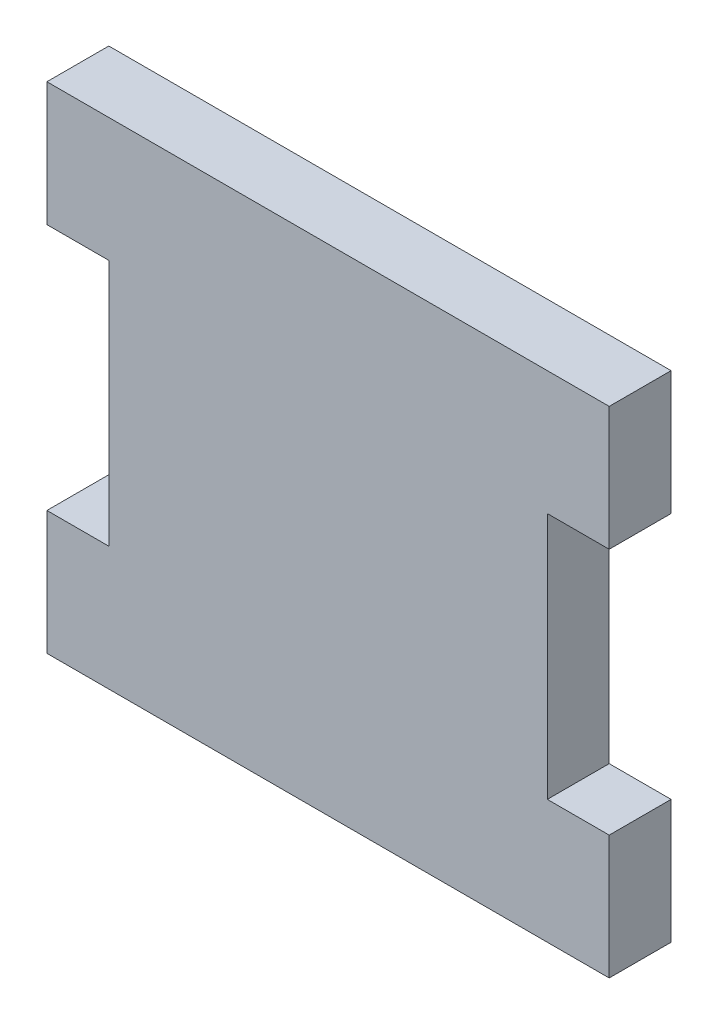
ISO-10303-21;
HEADER;
FILE_DESCRIPTION(('STEP AP214'),'2;1');
FILE_NAME('part.step','',(''),(''),'','','');
FILE_SCHEMA(('AUTOMOTIVE_DESIGN { 1 0 10303 214 1 1 1 1 }'));
ENDSEC;
DATA;
#1=APPLICATION_CONTEXT('core data for automotive mechanical design processes');
#2=APPLICATION_PROTOCOL_DEFINITION('international standard','automotive_design',2000,#1);
#3=PRODUCT_CONTEXT('',#1,'mechanical');
#4=PRODUCT('Part','Part','',(#3));
#5=PRODUCT_RELATED_PRODUCT_CATEGORY('part','',(#4));
#6=PRODUCT_DEFINITION_FORMATION('','',#4);
#7=PRODUCT_DEFINITION_CONTEXT('part definition',#1,'design');
#8=PRODUCT_DEFINITION('design','',#6,#7);
#9=PRODUCT_DEFINITION_SHAPE('','',#8);
#10=(LENGTH_UNIT() NAMED_UNIT(*) SI_UNIT(.MILLI.,.METRE.));
#11=(NAMED_UNIT(*) PLANE_ANGLE_UNIT() SI_UNIT($,.RADIAN.));
#12=(NAMED_UNIT(*) SI_UNIT($,.STERADIAN.) SOLID_ANGLE_UNIT());
#13=UNCERTAINTY_MEASURE_WITH_UNIT(LENGTH_MEASURE(1.E-05),#10,'distance_accuracy_value','');
#14=(GEOMETRIC_REPRESENTATION_CONTEXT(3) GLOBAL_UNCERTAINTY_ASSIGNED_CONTEXT((#13)) GLOBAL_UNIT_ASSIGNED_CONTEXT((#10,
#11,#12)) REPRESENTATION_CONTEXT('',''));
#15=CARTESIAN_POINT('',(0.,0.,0.));
#16=DIRECTION('',(0.,0.,1.));
#17=DIRECTION('',(1.,0.,0.));
#18=AXIS2_PLACEMENT_3D('',#15,#16,#17);
#19=CARTESIAN_POINT('',(0.,50.8,6.35));
#20=DIRECTION('',(0.,-1.,0.));
#21=DIRECTION('',(0.,0.,-1.));
#22=AXIS2_PLACEMENT_3D('',#19,#20,#21);
#23=PLANE('',#22);
#24=DIRECTION('',(-1.,0.,0.));
#25=VECTOR('',#24,1.);
#26=CARTESIAN_POINT('',(0.,50.8,0.));
#27=LINE('',#26,#25);
#28=CARTESIAN_POINT('',(57.7,50.8,0.));
#29=VERTEX_POINT('',#28);
#30=CARTESIAN_POINT('',(0.,50.8,0.));
#31=VERTEX_POINT('',#30);
#32=EDGE_CURVE('E177',#29,#31,#27,.T.);
#33=ORIENTED_EDGE('',*,*,#32,.T.);
#34=DIRECTION('',(0.,0.,-1.));
#35=VECTOR('',#34,1.);
#36=CARTESIAN_POINT('',(0.,50.8,6.35));
#37=LINE('',#36,#35);
#38=CARTESIAN_POINT('',(0.,50.8,6.35));
#39=VERTEX_POINT('',#38);
#40=EDGE_CURVE('E11',#39,#31,#37,.T.);
#41=ORIENTED_EDGE('',*,*,#40,.F.);
#42=DIRECTION('',(-1.,0.,0.));
#43=VECTOR('',#42,1.);
#44=CARTESIAN_POINT('',(0.,50.8,6.35));
#45=LINE('',#44,#43);
#46=CARTESIAN_POINT('',(57.7,50.8,6.35));
#47=VERTEX_POINT('',#46);
#48=EDGE_CURVE('E219',#47,#39,#45,.T.);
#49=ORIENTED_EDGE('',*,*,#48,.F.);
#50=DIRECTION('',(0.,0.,-1.));
#51=VECTOR('',#50,1.);
#52=CARTESIAN_POINT('',(57.7,50.8,6.35));
#53=LINE('',#52,#51);
#54=EDGE_CURVE('E38',#47,#29,#53,.T.);
#55=ORIENTED_EDGE('',*,*,#54,.T.);
#56=EDGE_LOOP('',(#33,#41,#49,#55));
#57=FACE_BOUND('',#56,.T.);
#58=ADVANCED_FACE('F16',(#57),#23,.F.);
#59=CARTESIAN_POINT('',(0.,0.,6.35));
#60=DIRECTION('',(1.,0.,0.));
#61=DIRECTION('',(0.,1.,0.));
#62=AXIS2_PLACEMENT_3D('',#59,#60,#61);
#63=PLANE('',#62);
#64=DIRECTION('',(0.,-1.,0.));
#65=VECTOR('',#64,1.);
#66=CARTESIAN_POINT('',(0.,0.,0.));
#67=LINE('',#66,#65);
#68=CARTESIAN_POINT('',(0.,38.1,0.));
#69=VERTEX_POINT('',#68);
#70=EDGE_CURVE('E180',#31,#69,#67,.T.);
#71=ORIENTED_EDGE('',*,*,#70,.T.);
#72=DIRECTION('',(0.,0.,-1.));
#73=VECTOR('',#72,1.);
#74=CARTESIAN_POINT('',(0.,38.1,6.35));
#75=LINE('',#74,#73);
#76=CARTESIAN_POINT('',(0.,38.1,6.35));
#77=VERTEX_POINT('',#76);
#78=EDGE_CURVE('E25',#77,#69,#75,.T.);
#79=ORIENTED_EDGE('',*,*,#78,.F.);
#80=DIRECTION('',(0.,-1.,0.));
#81=VECTOR('',#80,1.);
#82=CARTESIAN_POINT('',(0.,0.,6.35));
#83=LINE('',#82,#81);
#84=EDGE_CURVE('E106',#39,#77,#83,.T.);
#85=ORIENTED_EDGE('',*,*,#84,.F.);
#86=ORIENTED_EDGE('',*,*,#40,.T.);
#87=EDGE_LOOP('',(#71,#79,#85,#86));
#88=FACE_BOUND('',#87,.T.);
#89=ADVANCED_FACE('F252',(#88),#63,.F.);
#90=CARTESIAN_POINT('',(0.,38.1,6.35));
#91=DIRECTION('',(0.,-1.,0.));
#92=DIRECTION('',(0.,0.,-1.));
#93=AXIS2_PLACEMENT_3D('',#90,#91,#92);
#94=PLANE('',#93);
#95=DIRECTION('',(-1.,0.,0.));
#96=VECTOR('',#95,1.);
#97=CARTESIAN_POINT('',(0.,38.1,0.));
#98=LINE('',#97,#96);
#99=CARTESIAN_POINT('',(6.35,38.1,0.));
#100=VERTEX_POINT('',#99);
#101=EDGE_CURVE('E184',#100,#69,#98,.T.);
#102=ORIENTED_EDGE('',*,*,#101,.F.);
#103=DIRECTION('',(0.,0.,-1.));
#104=VECTOR('',#103,1.);
#105=CARTESIAN_POINT('',(6.35,38.1,6.35));
#106=LINE('',#105,#104);
#107=CARTESIAN_POINT('',(6.35,38.1,6.35));
#108=VERTEX_POINT('',#107);
#109=EDGE_CURVE('E242',#108,#100,#106,.T.);
#110=ORIENTED_EDGE('',*,*,#109,.F.);
#111=DIRECTION('',(-1.,0.,0.));
#112=VECTOR('',#111,1.);
#113=CARTESIAN_POINT('',(0.,38.1,6.35));
#114=LINE('',#113,#112);
#115=EDGE_CURVE('E251',#108,#77,#114,.T.);
#116=ORIENTED_EDGE('',*,*,#115,.T.);
#117=ORIENTED_EDGE('',*,*,#78,.T.);
#118=EDGE_LOOP('',(#102,#110,#116,#117));
#119=FACE_BOUND('',#118,.T.);
#120=ADVANCED_FACE('F249',(#119),#94,.T.);
#121=CARTESIAN_POINT('',(6.35000000000002,0.,6.35));
#122=DIRECTION('',(-1.,0.,0.));
#123=DIRECTION('',(0.,-1.,0.));
#124=AXIS2_PLACEMENT_3D('',#121,#122,#123);
#125=PLANE('',#124);
#126=DIRECTION('',(0.,1.,0.));
#127=VECTOR('',#126,1.);
#128=CARTESIAN_POINT('',(6.35000000000002,0.,0.));
#129=LINE('',#128,#127);
#130=CARTESIAN_POINT('',(6.35000000000002,12.7,0.));
#131=VERTEX_POINT('',#130);
#132=EDGE_CURVE('E188',#131,#100,#129,.T.);
#133=ORIENTED_EDGE('',*,*,#132,.F.);
#134=DIRECTION('',(0.,0.,-1.));
#135=VECTOR('',#134,1.);
#136=CARTESIAN_POINT('',(6.35000000000002,12.7,6.35));
#137=LINE('',#136,#135);
#138=CARTESIAN_POINT('',(6.35000000000002,12.7,6.35));
#139=VERTEX_POINT('',#138);
#140=EDGE_CURVE('E239',#139,#131,#137,.T.);
#141=ORIENTED_EDGE('',*,*,#140,.F.);
#142=DIRECTION('',(0.,1.,0.));
#143=VECTOR('',#142,1.);
#144=CARTESIAN_POINT('',(6.35000000000002,0.,6.35));
#145=LINE('',#144,#143);
#146=EDGE_CURVE('E262',#139,#108,#145,.T.);
#147=ORIENTED_EDGE('',*,*,#146,.T.);
#148=ORIENTED_EDGE('',*,*,#109,.T.);
#149=EDGE_LOOP('',(#133,#141,#147,#148));
#150=FACE_BOUND('',#149,.T.);
#151=ADVANCED_FACE('F259',(#150),#125,.T.);
#152=CARTESIAN_POINT('',(0.,12.7,6.35));
#153=DIRECTION('',(0.,1.,0.));
#154=DIRECTION('',(-1.,0.,0.));
#155=AXIS2_PLACEMENT_3D('',#152,#153,#154);
#156=PLANE('',#155);
#157=DIRECTION('',(1.,0.,0.));
#158=VECTOR('',#157,1.);
#159=CARTESIAN_POINT('',(0.,12.7,0.));
#160=LINE('',#159,#158);
#161=CARTESIAN_POINT('',(0.,12.7,0.));
#162=VERTEX_POINT('',#161);
#163=EDGE_CURVE('E192',#162,#131,#160,.T.);
#164=ORIENTED_EDGE('',*,*,#163,.F.);
#165=DIRECTION('',(0.,0.,-1.));
#166=VECTOR('',#165,1.);
#167=CARTESIAN_POINT('',(0.,12.7,6.35));
#168=LINE('',#167,#166);
#169=CARTESIAN_POINT('',(0.,12.7,6.35));
#170=VERTEX_POINT('',#169);
#171=EDGE_CURVE('E236',#170,#162,#168,.T.);
#172=ORIENTED_EDGE('',*,*,#171,.F.);
#173=DIRECTION('',(1.,0.,0.));
#174=VECTOR('',#173,1.);
#175=CARTESIAN_POINT('',(0.,12.7,6.35));
#176=LINE('',#175,#174);
#177=EDGE_CURVE('E271',#170,#139,#176,.T.);
#178=ORIENTED_EDGE('',*,*,#177,.T.);
#179=ORIENTED_EDGE('',*,*,#140,.T.);
#180=EDGE_LOOP('',(#164,#172,#178,#179));
#181=FACE_BOUND('',#180,.T.);
#182=ADVANCED_FACE('F443',(#181),#156,.T.);
#183=CARTESIAN_POINT('',(0.,0.,6.35));
#184=DIRECTION('',(-1.,0.,0.));
#185=DIRECTION('',(0.,0.,1.));
#186=AXIS2_PLACEMENT_3D('',#183,#184,#185);
#187=PLANE('',#186);
#188=DIRECTION('',(0.,1.,0.));
#189=VECTOR('',#188,1.);
#190=CARTESIAN_POINT('',(0.,0.,0.));
#191=LINE('',#190,#189);
#192=CARTESIAN_POINT('',(0.,0.,0.));
#193=VERTEX_POINT('',#192);
#194=EDGE_CURVE('E196',#193,#162,#191,.T.);
#195=ORIENTED_EDGE('',*,*,#194,.F.);
#196=DIRECTION('',(0.,0.,-1.));
#197=VECTOR('',#196,1.);
#198=CARTESIAN_POINT('',(0.,0.,6.35));
#199=LINE('',#198,#197);
#200=CARTESIAN_POINT('',(0.,0.,6.35));
#201=VERTEX_POINT('',#200);
#202=EDGE_CURVE('E233',#201,#193,#199,.T.);
#203=ORIENTED_EDGE('',*,*,#202,.F.);
#204=DIRECTION('',(0.,1.,0.));
#205=VECTOR('',#204,1.);
#206=CARTESIAN_POINT('',(0.,0.,6.35));
#207=LINE('',#206,#205);
#208=EDGE_CURVE('E279',#201,#170,#207,.T.);
#209=ORIENTED_EDGE('',*,*,#208,.T.);
#210=ORIENTED_EDGE('',*,*,#171,.T.);
#211=EDGE_LOOP('',(#195,#203,#209,#210));
#212=FACE_BOUND('',#211,.T.);
#213=ADVANCED_FACE('F514',(#212),#187,.T.);
#214=CARTESIAN_POINT('',(0.,0.,6.35));
#215=DIRECTION('',(0.,1.,0.));
#216=DIRECTION('',(0.,0.,1.));
#217=AXIS2_PLACEMENT_3D('',#214,#215,#216);
#218=PLANE('',#217);
#219=DIRECTION('',(1.,0.,0.));
#220=VECTOR('',#219,1.);
#221=CARTESIAN_POINT('',(0.,0.,0.));
#222=LINE('',#221,#220);
#223=CARTESIAN_POINT('',(57.7,0.,0.));
#224=VERTEX_POINT('',#223);
#225=EDGE_CURVE('E199',#193,#224,#222,.T.);
#226=ORIENTED_EDGE('',*,*,#225,.T.);
#227=DIRECTION('',(0.,0.,-1.));
#228=VECTOR('',#227,1.);
#229=CARTESIAN_POINT('',(57.7,0.,6.35));
#230=LINE('',#229,#228);
#231=CARTESIAN_POINT('',(57.7,0.,6.35));
#232=VERTEX_POINT('',#231);
#233=EDGE_CURVE('E229',#232,#224,#230,.T.);
#234=ORIENTED_EDGE('',*,*,#233,.F.);
#235=DIRECTION('',(1.,0.,0.));
#236=VECTOR('',#235,1.);
#237=CARTESIAN_POINT('',(0.,0.,6.35));
#238=LINE('',#237,#236);
#239=EDGE_CURVE('E283',#201,#232,#238,.T.);
#240=ORIENTED_EDGE('',*,*,#239,.F.);
#241=ORIENTED_EDGE('',*,*,#202,.T.);
#242=EDGE_LOOP('',(#226,#234,#240,#241));
#243=FACE_BOUND('',#242,.T.);
#244=ADVANCED_FACE('F503',(#243),#218,.F.);
#245=CARTESIAN_POINT('',(57.7,0.,6.35));
#246=DIRECTION('',(-1.,0.,0.));
#247=DIRECTION('',(0.,0.,1.));
#248=AXIS2_PLACEMENT_3D('',#245,#246,#247);
#249=PLANE('',#248);
#250=DIRECTION('',(0.,1.,0.));
#251=VECTOR('',#250,1.);
#252=CARTESIAN_POINT('',(57.7,0.,0.));
#253=LINE('',#252,#251);
#254=CARTESIAN_POINT('',(57.7,12.7,0.));
#255=VERTEX_POINT('',#254);
#256=EDGE_CURVE('E202',#224,#255,#253,.T.);
#257=ORIENTED_EDGE('',*,*,#256,.T.);
#258=DIRECTION('',(0.,0.,-1.));
#259=VECTOR('',#258,1.);
#260=CARTESIAN_POINT('',(57.7,12.7,6.35));
#261=LINE('',#260,#259);
#262=CARTESIAN_POINT('',(57.7,12.7,6.35));
#263=VERTEX_POINT('',#262);
#264=EDGE_CURVE('E226',#263,#255,#261,.T.);
#265=ORIENTED_EDGE('',*,*,#264,.F.);
#266=DIRECTION('',(0.,1.,0.));
#267=VECTOR('',#266,1.);
#268=CARTESIAN_POINT('',(57.7,0.,6.35));
#269=LINE('',#268,#267);
#270=EDGE_CURVE('E286',#232,#263,#269,.T.);
#271=ORIENTED_EDGE('',*,*,#270,.F.);
#272=ORIENTED_EDGE('',*,*,#233,.T.);
#273=EDGE_LOOP('',(#257,#265,#271,#272));
#274=FACE_BOUND('',#273,.T.);
#275=ADVANCED_FACE('F493',(#274),#249,.F.);
#276=CARTESIAN_POINT('',(0.,12.7,6.35));
#277=DIRECTION('',(0.,1.,0.));
#278=DIRECTION('',(0.,0.,1.));
#279=AXIS2_PLACEMENT_3D('',#276,#277,#278);
#280=PLANE('',#279);
#281=DIRECTION('',(1.,0.,0.));
#282=VECTOR('',#281,1.);
#283=CARTESIAN_POINT('',(0.,12.7,0.));
#284=LINE('',#283,#282);
#285=CARTESIAN_POINT('',(51.35,12.7,0.));
#286=VERTEX_POINT('',#285);
#287=EDGE_CURVE('E206',#286,#255,#284,.T.);
#288=ORIENTED_EDGE('',*,*,#287,.F.);
#289=DIRECTION('',(0.,0.,-1.));
#290=VECTOR('',#289,1.);
#291=CARTESIAN_POINT('',(51.35,12.7,6.35));
#292=LINE('',#291,#290);
#293=CARTESIAN_POINT('',(51.35,12.7,6.35));
#294=VERTEX_POINT('',#293);
#295=EDGE_CURVE('E162',#294,#286,#292,.T.);
#296=ORIENTED_EDGE('',*,*,#295,.F.);
#297=DIRECTION('',(1.,0.,0.));
#298=VECTOR('',#297,1.);
#299=CARTESIAN_POINT('',(0.,12.7,6.35));
#300=LINE('',#299,#298);
#301=EDGE_CURVE('E150',#294,#263,#300,.T.);
#302=ORIENTED_EDGE('',*,*,#301,.T.);
#303=ORIENTED_EDGE('',*,*,#264,.T.);
#304=EDGE_LOOP('',(#288,#296,#302,#303));
#305=FACE_BOUND('',#304,.T.);
#306=ADVANCED_FACE('F294',(#305),#280,.T.);
#307=CARTESIAN_POINT('',(51.35,0.,6.35));
#308=DIRECTION('',(-1.,0.,0.));
#309=DIRECTION('',(0.,-1.,0.));
#310=AXIS2_PLACEMENT_3D('',#307,#308,#309);
#311=PLANE('',#310);
#312=DIRECTION('',(0.,1.,0.));
#313=VECTOR('',#312,1.);
#314=CARTESIAN_POINT('',(51.35,0.,0.));
#315=LINE('',#314,#313);
#316=CARTESIAN_POINT('',(51.35,38.1,0.));
#317=VERTEX_POINT('',#316);
#318=EDGE_CURVE('E158',#286,#317,#315,.T.);
#319=ORIENTED_EDGE('',*,*,#318,.T.);
#320=DIRECTION('',(0.,0.,-1.));
#321=VECTOR('',#320,1.);
#322=CARTESIAN_POINT('',(51.35,38.1,6.35));
#323=LINE('',#322,#321);
#324=CARTESIAN_POINT('',(51.35,38.1,6.35));
#325=VERTEX_POINT('',#324);
#326=EDGE_CURVE('E155',#325,#317,#323,.T.);
#327=ORIENTED_EDGE('',*,*,#326,.F.);
#328=DIRECTION('',(0.,1.,0.));
#329=VECTOR('',#328,1.);
#330=CARTESIAN_POINT('',(51.35,0.,6.35));
#331=LINE('',#330,#329);
#332=EDGE_CURVE('E143',#294,#325,#331,.T.);
#333=ORIENTED_EDGE('',*,*,#332,.F.);
#334=ORIENTED_EDGE('',*,*,#295,.T.);
#335=EDGE_LOOP('',(#319,#327,#333,#334));
#336=FACE_BOUND('',#335,.T.);
#337=ADVANCED_FACE('F156',(#336),#311,.F.);
#338=CARTESIAN_POINT('',(0.,38.1,6.35));
#339=DIRECTION('',(0.,1.,0.));
#340=DIRECTION('',(0.,0.,1.));
#341=AXIS2_PLACEMENT_3D('',#338,#339,#340);
#342=PLANE('',#341);
#343=DIRECTION('',(1.,0.,0.));
#344=VECTOR('',#343,1.);
#345=CARTESIAN_POINT('',(0.,38.1,0.));
#346=LINE('',#345,#344);
#347=CARTESIAN_POINT('',(57.7,38.1,0.));
#348=VERTEX_POINT('',#347);
#349=EDGE_CURVE('E212',#317,#348,#346,.T.);
#350=ORIENTED_EDGE('',*,*,#349,.T.);
#351=DIRECTION('',(0.,0.,-1.));
#352=VECTOR('',#351,1.);
#353=CARTESIAN_POINT('',(57.7,38.1,6.35));
#354=LINE('',#353,#352);
#355=CARTESIAN_POINT('',(57.7,38.1,6.35));
#356=VERTEX_POINT('',#355);
#357=EDGE_CURVE('E90',#356,#348,#354,.T.);
#358=ORIENTED_EDGE('',*,*,#357,.F.);
#359=DIRECTION('',(1.,0.,0.));
#360=VECTOR('',#359,1.);
#361=CARTESIAN_POINT('',(0.,38.1,6.35));
#362=LINE('',#361,#360);
#363=EDGE_CURVE('E148',#325,#356,#362,.T.);
#364=ORIENTED_EDGE('',*,*,#363,.F.);
#365=ORIENTED_EDGE('',*,*,#326,.T.);
#366=EDGE_LOOP('',(#350,#358,#364,#365));
#367=FACE_BOUND('',#366,.T.);
#368=ADVANCED_FACE('F164',(#367),#342,.F.);
#369=CARTESIAN_POINT('',(57.7000000000001,0.,6.35));
#370=DIRECTION('',(1.,0.,0.));
#371=DIRECTION('',(0.,1.,0.));
#372=AXIS2_PLACEMENT_3D('',#369,#370,#371);
#373=PLANE('',#372);
#374=DIRECTION('',(0.,-1.,0.));
#375=VECTOR('',#374,1.);
#376=CARTESIAN_POINT('',(57.7000000000001,0.,0.));
#377=LINE('',#376,#375);
#378=EDGE_CURVE('E215',#29,#348,#377,.T.);
#379=ORIENTED_EDGE('',*,*,#378,.F.);
#380=ORIENTED_EDGE('',*,*,#54,.F.);
#381=DIRECTION('',(0.,-1.,0.));
#382=VECTOR('',#381,1.);
#383=CARTESIAN_POINT('',(57.7000000000001,0.,6.35));
#384=LINE('',#383,#382);
#385=EDGE_CURVE('E166',#47,#356,#384,.T.);
#386=ORIENTED_EDGE('',*,*,#385,.T.);
#387=ORIENTED_EDGE('',*,*,#357,.T.);
#388=EDGE_LOOP('',(#379,#380,#386,#387));
#389=FACE_BOUND('',#388,.T.);
#390=ADVANCED_FACE('F297',(#389),#373,.T.);
#391=CARTESIAN_POINT('',(0.,0.,6.35));
#392=DIRECTION('',(0.,0.,1.));
#393=DIRECTION('',(1.,0.,0.));
#394=AXIS2_PLACEMENT_3D('',#391,#392,#393);
#395=PLANE('',#394);
#396=ORIENTED_EDGE('',*,*,#48,.T.);
#397=ORIENTED_EDGE('',*,*,#84,.T.);
#398=ORIENTED_EDGE('',*,*,#115,.F.);
#399=ORIENTED_EDGE('',*,*,#146,.F.);
#400=ORIENTED_EDGE('',*,*,#177,.F.);
#401=ORIENTED_EDGE('',*,*,#208,.F.);
#402=ORIENTED_EDGE('',*,*,#239,.T.);
#403=ORIENTED_EDGE('',*,*,#270,.T.);
#404=ORIENTED_EDGE('',*,*,#301,.F.);
#405=ORIENTED_EDGE('',*,*,#332,.T.);
#406=ORIENTED_EDGE('',*,*,#363,.T.);
#407=ORIENTED_EDGE('',*,*,#385,.F.);
#408=EDGE_LOOP('',(#396,#397,#398,#399,#400,#401,#402,#403,#404,#405,#406,#407));
#409=FACE_BOUND('',#408,.T.);
#410=ADVANCED_FACE('F145',(#409),#395,.T.);
#411=CARTESIAN_POINT('',(0.,0.,0.));
#412=DIRECTION('',(0.,0.,1.));
#413=DIRECTION('',(1.,0.,0.));
#414=AXIS2_PLACEMENT_3D('',#411,#412,#413);
#415=PLANE('',#414);
#416=ORIENTED_EDGE('',*,*,#32,.F.);
#417=ORIENTED_EDGE('',*,*,#378,.T.);
#418=ORIENTED_EDGE('',*,*,#349,.F.);
#419=ORIENTED_EDGE('',*,*,#318,.F.);
#420=ORIENTED_EDGE('',*,*,#287,.T.);
#421=ORIENTED_EDGE('',*,*,#256,.F.);
#422=ORIENTED_EDGE('',*,*,#225,.F.);
#423=ORIENTED_EDGE('',*,*,#194,.T.);
#424=ORIENTED_EDGE('',*,*,#163,.T.);
#425=ORIENTED_EDGE('',*,*,#132,.T.);
#426=ORIENTED_EDGE('',*,*,#101,.T.);
#427=ORIENTED_EDGE('',*,*,#70,.F.);
#428=EDGE_LOOP('',(#416,#417,#418,#419,#420,#421,#422,#423,#424,#425,#426,#427));
#429=FACE_BOUND('',#428,.T.);
#430=ADVANCED_FACE('F255',(#429),#415,.F.);
#431=CLOSED_SHELL('',(#58,#89,#120,#151,#182,#213,#244,#275,#306,#337,#368,#390,#410,#430));
#432=MANIFOLD_SOLID_BREP('B1',#431);
#433=ADVANCED_BREP_SHAPE_REPRESENTATION('',(#18,#432),#14);
#434=SHAPE_DEFINITION_REPRESENTATION(#9,#433);
ENDSEC;
END-ISO-10303-21;
